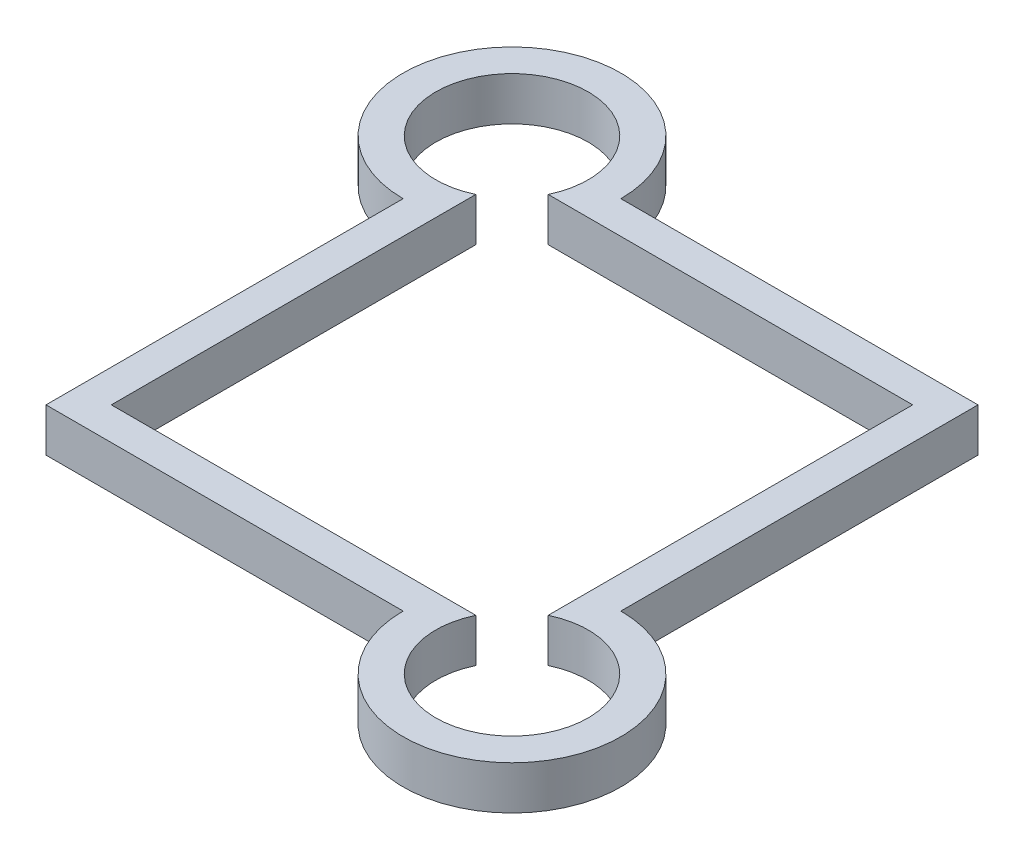
ISO-10303-21;
HEADER;
FILE_DESCRIPTION(('STEP AP214'),'2;1');
FILE_NAME('part.step','',(''),(''),'','','');
FILE_SCHEMA(('AUTOMOTIVE_DESIGN { 1 0 10303 214 1 1 1 1 }'));
ENDSEC;
DATA;
#1=APPLICATION_CONTEXT('core data for automotive mechanical design processes');
#2=APPLICATION_PROTOCOL_DEFINITION('international standard','automotive_design',2000,#1);
#3=PRODUCT_CONTEXT('',#1,'mechanical');
#4=PRODUCT('Part','Part','',(#3));
#5=PRODUCT_RELATED_PRODUCT_CATEGORY('part','',(#4));
#6=PRODUCT_DEFINITION_FORMATION('','',#4);
#7=PRODUCT_DEFINITION_CONTEXT('part definition',#1,'design');
#8=PRODUCT_DEFINITION('design','',#6,#7);
#9=PRODUCT_DEFINITION_SHAPE('','',#8);
#10=(LENGTH_UNIT() NAMED_UNIT(*) SI_UNIT(.MILLI.,.METRE.));
#11=(NAMED_UNIT(*) PLANE_ANGLE_UNIT() SI_UNIT($,.RADIAN.));
#12=(NAMED_UNIT(*) SI_UNIT($,.STERADIAN.) SOLID_ANGLE_UNIT());
#13=UNCERTAINTY_MEASURE_WITH_UNIT(LENGTH_MEASURE(1.E-05),#10,'distance_accuracy_value','');
#14=(GEOMETRIC_REPRESENTATION_CONTEXT(3) GLOBAL_UNCERTAINTY_ASSIGNED_CONTEXT((#13)) GLOBAL_UNIT_ASSIGNED_CONTEXT((#10,
#11,#12)) REPRESENTATION_CONTEXT('',''));
#15=CARTESIAN_POINT('',(0.,0.,0.));
#16=DIRECTION('',(0.,0.,1.));
#17=DIRECTION('',(1.,0.,0.));
#18=AXIS2_PLACEMENT_3D('',#15,#16,#17);
#19=CARTESIAN_POINT('',(116.153392330384,20.,131.619469026549));
#20=DIRECTION('',(0.,-1.,0.));
#21=DIRECTION('',(0.,0.,-1.));
#22=AXIS2_PLACEMENT_3D('',#19,#20,#21);
#23=PLANE('',#22);
#24=DIRECTION('',(1.,0.,0.));
#25=VECTOR('',#24,1.);
#26=CARTESIAN_POINT('',(-97.8466076696164,20.,131.619469026549));
#27=LINE('',#26,#25);
#28=CARTESIAN_POINT('',(-97.8466076696164,20.,131.619469026549));
#29=VERTEX_POINT('',#28);
#30=CARTESIAN_POINT('',(66.1533923303835,20.,131.619469026549));
#31=VERTEX_POINT('',#30);
#32=EDGE_CURVE('E173',#29,#31,#27,.T.);
#33=ORIENTED_EDGE('',*,*,#32,.T.);
#34=CARTESIAN_POINT('',(116.153392330384,20.,131.619469026549));
#35=DIRECTION('',(0.,1.,0.));
#36=DIRECTION('',(0.,0.,-1.));
#37=AXIS2_PLACEMENT_3D('',#34,#35,#36);
#38=CIRCLE('',#37,50.0000000000001);
#39=CARTESIAN_POINT('',(116.153392330384,20.,81.6194690265486));
#40=VERTEX_POINT('',#39);
#41=EDGE_CURVE('E176',#31,#40,#38,.T.);
#42=ORIENTED_EDGE('',*,*,#41,.T.);
#43=DIRECTION('',(0.,0.,-1.));
#44=VECTOR('',#43,1.);
#45=CARTESIAN_POINT('',(116.153392330384,20.,-82.3805309734513));
#46=LINE('',#45,#44);
#47=CARTESIAN_POINT('',(116.153392330384,20.,-82.3805309734513));
#48=VERTEX_POINT('',#47);
#49=EDGE_CURVE('E179',#40,#48,#46,.T.);
#50=ORIENTED_EDGE('',*,*,#49,.T.);
#51=DIRECTION('',(-1.,0.,0.));
#52=VECTOR('',#51,1.);
#53=CARTESIAN_POINT('',(-47.8466076696164,20.,-82.3805309734513));
#54=LINE('',#53,#52);
#55=CARTESIAN_POINT('',(-47.8466076696164,20.,-82.3805309734513));
#56=VERTEX_POINT('',#55);
#57=EDGE_CURVE('E181',#48,#56,#54,.T.);
#58=ORIENTED_EDGE('',*,*,#57,.T.);
#59=CARTESIAN_POINT('',(-97.8466076696164,20.,-82.3805309734513));
#60=DIRECTION('',(0.,1.,0.));
#61=DIRECTION('',(0.,0.,1.));
#62=AXIS2_PLACEMENT_3D('',#59,#60,#61);
#63=CIRCLE('',#62,50.);
#64=CARTESIAN_POINT('',(-97.8466076696164,20.,-32.3805309734513));
#65=VERTEX_POINT('',#64);
#66=EDGE_CURVE('E183',#56,#65,#63,.T.);
#67=ORIENTED_EDGE('',*,*,#66,.T.);
#68=DIRECTION('',(0.,0.,1.));
#69=VECTOR('',#68,1.);
#70=CARTESIAN_POINT('',(-97.8466076696164,20.,-32.3805309734513));
#71=LINE('',#70,#69);
#72=EDGE_CURVE('E185',#65,#29,#71,.T.);
#73=ORIENTED_EDGE('',*,*,#72,.T.);
#74=EDGE_LOOP('',(#33,#42,#50,#58,#67,#73));
#75=FACE_BOUND('',#74,.T.);
#76=DIRECTION('',(1.,0.,0.));
#77=VECTOR('',#76,1.);
#78=CARTESIAN_POINT('',(-82.8466076696164,20.,116.619469026549));
#79=LINE('',#78,#77);
#80=CARTESIAN_POINT('',(-82.8466076696164,20.,116.619469026549));
#81=VERTEX_POINT('',#80);
#82=CARTESIAN_POINT('',(84.5306157286997,20.,116.619469026549));
#83=VERTEX_POINT('',#82);
#84=EDGE_CURVE('E122',#81,#83,#79,.T.);
#85=ORIENTED_EDGE('',*,*,#84,.F.);
#86=DIRECTION('',(0.,0.,1.));
#87=VECTOR('',#86,1.);
#88=CARTESIAN_POINT('',(-82.8466076696164,20.,-50.7577543717675));
#89=LINE('',#88,#87);
#90=CARTESIAN_POINT('',(-82.8466076696164,20.,-50.7577543717675));
#91=VERTEX_POINT('',#90);
#92=EDGE_CURVE('E151',#91,#81,#89,.T.);
#93=ORIENTED_EDGE('',*,*,#92,.F.);
#94=CARTESIAN_POINT('',(-97.8466076696164,20.,-82.3805309734513));
#95=DIRECTION('',(0.,1.,0.));
#96=DIRECTION('',(0.,0.,1.));
#97=AXIS2_PLACEMENT_3D('',#94,#95,#96);
#98=CIRCLE('',#97,35.);
#99=CARTESIAN_POINT('',(-66.2238310679326,20.,-67.3805309734513));
#100=VERTEX_POINT('',#99);
#101=EDGE_CURVE('E149',#100,#91,#98,.T.);
#102=ORIENTED_EDGE('',*,*,#101,.F.);
#103=DIRECTION('',(-1.,0.,0.));
#104=VECTOR('',#103,1.);
#105=CARTESIAN_POINT('',(-66.2238310679326,20.,-67.3805309734513));
#106=LINE('',#105,#104);
#107=CARTESIAN_POINT('',(101.153392330384,20.,-67.3805309734513));
#108=VERTEX_POINT('',#107);
#109=EDGE_CURVE('E145',#108,#100,#106,.T.);
#110=ORIENTED_EDGE('',*,*,#109,.F.);
#111=DIRECTION('',(0.,0.,-1.));
#112=VECTOR('',#111,1.);
#113=CARTESIAN_POINT('',(101.153392330384,20.,-67.3805309734513));
#114=LINE('',#113,#112);
#115=CARTESIAN_POINT('',(101.153392330384,20.,99.9966924248648));
#116=VERTEX_POINT('',#115);
#117=EDGE_CURVE('E143',#116,#108,#114,.T.);
#118=ORIENTED_EDGE('',*,*,#117,.F.);
#119=CARTESIAN_POINT('',(116.153392330384,20.,131.619469026549));
#120=DIRECTION('',(0.,1.,0.));
#121=DIRECTION('',(0.,0.,-1.));
#122=AXIS2_PLACEMENT_3D('',#119,#120,#121);
#123=CIRCLE('',#122,35.0000000000001);
#124=EDGE_CURVE('E130',#83,#116,#123,.T.);
#125=ORIENTED_EDGE('',*,*,#124,.F.);
#126=EDGE_LOOP('',(#85,#93,#102,#110,#118,#125));
#127=FACE_BOUND('',#126,.T.);
#128=ADVANCED_FACE('F33',(#75,#127),#23,.F.);
#129=CARTESIAN_POINT('',(116.153392330384,0.,131.619469026549));
#130=DIRECTION('',(0.,-1.,0.));
#131=DIRECTION('',(0.,0.,-1.));
#132=AXIS2_PLACEMENT_3D('',#129,#130,#131);
#133=PLANE('',#132);
#134=DIRECTION('',(1.,0.,0.));
#135=VECTOR('',#134,1.);
#136=CARTESIAN_POINT('',(-97.8466076696164,0.,131.619469026549));
#137=LINE('',#136,#135);
#138=CARTESIAN_POINT('',(-97.8466076696164,0.,131.619469026549));
#139=VERTEX_POINT('',#138);
#140=CARTESIAN_POINT('',(66.1533923303835,0.,131.619469026549));
#141=VERTEX_POINT('',#140);
#142=EDGE_CURVE('E138',#139,#141,#137,.T.);
#143=ORIENTED_EDGE('',*,*,#142,.F.);
#144=DIRECTION('',(0.,0.,1.));
#145=VECTOR('',#144,1.);
#146=CARTESIAN_POINT('',(-97.8466076696164,0.,-32.3805309734513));
#147=LINE('',#146,#145);
#148=CARTESIAN_POINT('',(-97.8466076696164,0.,-32.3805309734513));
#149=VERTEX_POINT('',#148);
#150=EDGE_CURVE('E177',#149,#139,#147,.T.);
#151=ORIENTED_EDGE('',*,*,#150,.F.);
#152=CARTESIAN_POINT('',(-97.8466076696164,0.,-82.3805309734513));
#153=DIRECTION('',(0.,1.,0.));
#154=DIRECTION('',(0.,0.,1.));
#155=AXIS2_PLACEMENT_3D('',#152,#153,#154);
#156=CIRCLE('',#155,50.);
#157=CARTESIAN_POINT('',(-47.8466076696164,0.,-82.3805309734513));
#158=VERTEX_POINT('',#157);
#159=EDGE_CURVE('E196',#158,#149,#156,.T.);
#160=ORIENTED_EDGE('',*,*,#159,.F.);
#161=DIRECTION('',(-1.,0.,0.));
#162=VECTOR('',#161,1.);
#163=CARTESIAN_POINT('',(-47.8466076696164,0.,-82.3805309734513));
#164=LINE('',#163,#162);
#165=CARTESIAN_POINT('',(116.153392330384,0.,-82.3805309734513));
#166=VERTEX_POINT('',#165);
#167=EDGE_CURVE('E194',#166,#158,#164,.T.);
#168=ORIENTED_EDGE('',*,*,#167,.F.);
#169=DIRECTION('',(0.,0.,-1.));
#170=VECTOR('',#169,1.);
#171=CARTESIAN_POINT('',(116.153392330384,0.,-82.3805309734513));
#172=LINE('',#171,#170);
#173=CARTESIAN_POINT('',(116.153392330384,0.,81.6194690265486));
#174=VERTEX_POINT('',#173);
#175=EDGE_CURVE('E192',#174,#166,#172,.T.);
#176=ORIENTED_EDGE('',*,*,#175,.F.);
#177=CARTESIAN_POINT('',(116.153392330384,0.,131.619469026549));
#178=DIRECTION('',(0.,1.,0.));
#179=DIRECTION('',(0.,0.,-1.));
#180=AXIS2_PLACEMENT_3D('',#177,#178,#179);
#181=CIRCLE('',#180,50.0000000000001);
#182=EDGE_CURVE('E190',#141,#174,#181,.T.);
#183=ORIENTED_EDGE('',*,*,#182,.F.);
#184=EDGE_LOOP('',(#143,#151,#160,#168,#176,#183));
#185=FACE_BOUND('',#184,.T.);
#186=DIRECTION('',(0.,0.,1.));
#187=VECTOR('',#186,1.);
#188=CARTESIAN_POINT('',(-82.8466076696164,0.,-50.7577543717675));
#189=LINE('',#188,#187);
#190=CARTESIAN_POINT('',(-82.8466076696164,0.,-50.7577543717675));
#191=VERTEX_POINT('',#190);
#192=CARTESIAN_POINT('',(-82.8466076696164,0.,116.619469026549));
#193=VERTEX_POINT('',#192);
#194=EDGE_CURVE('E131',#191,#193,#189,.T.);
#195=ORIENTED_EDGE('',*,*,#194,.T.);
#196=DIRECTION('',(1.,0.,0.));
#197=VECTOR('',#196,1.);
#198=CARTESIAN_POINT('',(-82.8466076696164,0.,116.619469026549));
#199=LINE('',#198,#197);
#200=CARTESIAN_POINT('',(84.5306157286997,0.,116.619469026549));
#201=VERTEX_POINT('',#200);
#202=EDGE_CURVE('E56',#193,#201,#199,.T.);
#203=ORIENTED_EDGE('',*,*,#202,.T.);
#204=CARTESIAN_POINT('',(116.153392330384,0.,131.619469026549));
#205=DIRECTION('',(0.,1.,0.));
#206=DIRECTION('',(0.,0.,-1.));
#207=AXIS2_PLACEMENT_3D('',#204,#205,#206);
#208=CIRCLE('',#207,35.0000000000001);
#209=CARTESIAN_POINT('',(101.153392330384,0.,99.9966924248648));
#210=VERTEX_POINT('',#209);
#211=EDGE_CURVE('E137',#201,#210,#208,.T.);
#212=ORIENTED_EDGE('',*,*,#211,.T.);
#213=DIRECTION('',(0.,0.,-1.));
#214=VECTOR('',#213,1.);
#215=CARTESIAN_POINT('',(101.153392330384,0.,-67.3805309734513));
#216=LINE('',#215,#214);
#217=CARTESIAN_POINT('',(101.153392330384,0.,-67.3805309734513));
#218=VERTEX_POINT('',#217);
#219=EDGE_CURVE('E155',#210,#218,#216,.T.);
#220=ORIENTED_EDGE('',*,*,#219,.T.);
#221=DIRECTION('',(-1.,0.,0.));
#222=VECTOR('',#221,1.);
#223=CARTESIAN_POINT('',(-66.2238310679326,0.,-67.3805309734513));
#224=LINE('',#223,#222);
#225=CARTESIAN_POINT('',(-66.2238310679326,0.,-67.3805309734513));
#226=VERTEX_POINT('',#225);
#227=EDGE_CURVE('E158',#218,#226,#224,.T.);
#228=ORIENTED_EDGE('',*,*,#227,.T.);
#229=CARTESIAN_POINT('',(-97.8466076696164,0.,-82.3805309734513));
#230=DIRECTION('',(0.,1.,0.));
#231=DIRECTION('',(0.,0.,1.));
#232=AXIS2_PLACEMENT_3D('',#229,#230,#231);
#233=CIRCLE('',#232,35.);
#234=EDGE_CURVE('E161',#226,#191,#233,.T.);
#235=ORIENTED_EDGE('',*,*,#234,.T.);
#236=EDGE_LOOP('',(#195,#203,#212,#220,#228,#235));
#237=FACE_BOUND('',#236,.T.);
#238=ADVANCED_FACE('F220',(#185,#237),#133,.T.);
#239=CARTESIAN_POINT('',(-97.8466076696164,20.,131.619469026549));
#240=DIRECTION('',(0.,0.,-1.));
#241=DIRECTION('',(-1.,0.,0.));
#242=AXIS2_PLACEMENT_3D('',#239,#240,#241);
#243=PLANE('',#242);
#244=ORIENTED_EDGE('',*,*,#142,.T.);
#245=DIRECTION('',(0.,-1.,0.));
#246=VECTOR('',#245,1.);
#247=CARTESIAN_POINT('',(66.1533923303835,20.,131.619469026549));
#248=LINE('',#247,#246);
#249=EDGE_CURVE('E11',#31,#141,#248,.T.);
#250=ORIENTED_EDGE('',*,*,#249,.F.);
#251=ORIENTED_EDGE('',*,*,#32,.F.);
#252=DIRECTION('',(0.,-1.,0.));
#253=VECTOR('',#252,1.);
#254=CARTESIAN_POINT('',(-97.8466076696164,20.,131.619469026549));
#255=LINE('',#254,#253);
#256=EDGE_CURVE('E187',#29,#139,#255,.T.);
#257=ORIENTED_EDGE('',*,*,#256,.T.);
#258=EDGE_LOOP('',(#244,#250,#251,#257));
#259=FACE_BOUND('',#258,.T.);
#260=ADVANCED_FACE('F35',(#259),#243,.F.);
#261=CARTESIAN_POINT('',(116.153392330384,20.,131.619469026549));
#262=DIRECTION('',(0.,-1.,0.));
#263=DIRECTION('',(0.,0.,-1.));
#264=AXIS2_PLACEMENT_3D('',#261,#262,#263);
#265=CYLINDRICAL_SURFACE('',#264,50.0000000000001);
#266=ORIENTED_EDGE('',*,*,#182,.T.);
#267=DIRECTION('',(0.,-1.,0.));
#268=VECTOR('',#267,1.);
#269=CARTESIAN_POINT('',(116.153392330384,20.,81.6194690265486));
#270=LINE('',#269,#268);
#271=EDGE_CURVE('E41',#40,#174,#270,.T.);
#272=ORIENTED_EDGE('',*,*,#271,.F.);
#273=ORIENTED_EDGE('',*,*,#41,.F.);
#274=ORIENTED_EDGE('',*,*,#249,.T.);
#275=EDGE_LOOP('',(#266,#272,#273,#274));
#276=FACE_BOUND('',#275,.T.);
#277=ADVANCED_FACE('F237',(#276),#265,.T.);
#278=CARTESIAN_POINT('',(116.153392330384,20.,-82.3805309734513));
#279=DIRECTION('',(-1.,0.,0.));
#280=DIRECTION('',(0.,0.,1.));
#281=AXIS2_PLACEMENT_3D('',#278,#279,#280);
#282=PLANE('',#281);
#283=ORIENTED_EDGE('',*,*,#175,.T.);
#284=DIRECTION('',(0.,-1.,0.));
#285=VECTOR('',#284,1.);
#286=CARTESIAN_POINT('',(116.153392330384,20.,-82.3805309734513));
#287=LINE('',#286,#285);
#288=EDGE_CURVE('E207',#48,#166,#287,.T.);
#289=ORIENTED_EDGE('',*,*,#288,.F.);
#290=ORIENTED_EDGE('',*,*,#49,.F.);
#291=ORIENTED_EDGE('',*,*,#271,.T.);
#292=EDGE_LOOP('',(#283,#289,#290,#291));
#293=FACE_BOUND('',#292,.T.);
#294=ADVANCED_FACE('F214',(#293),#282,.F.);
#295=CARTESIAN_POINT('',(-47.8466076696164,20.,-82.3805309734513));
#296=DIRECTION('',(0.,0.,1.));
#297=DIRECTION('',(1.,0.,0.));
#298=AXIS2_PLACEMENT_3D('',#295,#296,#297);
#299=PLANE('',#298);
#300=ORIENTED_EDGE('',*,*,#167,.T.);
#301=DIRECTION('',(0.,-1.,0.));
#302=VECTOR('',#301,1.);
#303=CARTESIAN_POINT('',(-47.8466076696164,20.,-82.3805309734513));
#304=LINE('',#303,#302);
#305=EDGE_CURVE('E204',#56,#158,#304,.T.);
#306=ORIENTED_EDGE('',*,*,#305,.F.);
#307=ORIENTED_EDGE('',*,*,#57,.F.);
#308=ORIENTED_EDGE('',*,*,#288,.T.);
#309=EDGE_LOOP('',(#300,#306,#307,#308));
#310=FACE_BOUND('',#309,.T.);
#311=ADVANCED_FACE('F226',(#310),#299,.F.);
#312=CARTESIAN_POINT('',(-97.8466076696164,20.,-82.3805309734513));
#313=DIRECTION('',(0.,-1.,0.));
#314=DIRECTION('',(0.,0.,-1.));
#315=AXIS2_PLACEMENT_3D('',#312,#313,#314);
#316=CYLINDRICAL_SURFACE('',#315,50.);
#317=ORIENTED_EDGE('',*,*,#159,.T.);
#318=DIRECTION('',(0.,-1.,0.));
#319=VECTOR('',#318,1.);
#320=CARTESIAN_POINT('',(-97.8466076696164,20.,-32.3805309734513));
#321=LINE('',#320,#319);
#322=EDGE_CURVE('E201',#65,#149,#321,.T.);
#323=ORIENTED_EDGE('',*,*,#322,.F.);
#324=ORIENTED_EDGE('',*,*,#66,.F.);
#325=ORIENTED_EDGE('',*,*,#305,.T.);
#326=EDGE_LOOP('',(#317,#323,#324,#325));
#327=FACE_BOUND('',#326,.T.);
#328=ADVANCED_FACE('F230',(#327),#316,.T.);
#329=CARTESIAN_POINT('',(-97.8466076696164,20.,-32.3805309734513));
#330=DIRECTION('',(1.,0.,0.));
#331=DIRECTION('',(0.,0.,-1.));
#332=AXIS2_PLACEMENT_3D('',#329,#330,#331);
#333=PLANE('',#332);
#334=ORIENTED_EDGE('',*,*,#150,.T.);
#335=ORIENTED_EDGE('',*,*,#256,.F.);
#336=ORIENTED_EDGE('',*,*,#72,.F.);
#337=ORIENTED_EDGE('',*,*,#322,.T.);
#338=EDGE_LOOP('',(#334,#335,#336,#337));
#339=FACE_BOUND('',#338,.T.);
#340=ADVANCED_FACE('F240',(#339),#333,.F.);
#341=CARTESIAN_POINT('',(-82.8466076696164,20.,116.619469026549));
#342=DIRECTION('',(0.,0.,-1.));
#343=DIRECTION('',(-1.,0.,0.));
#344=AXIS2_PLACEMENT_3D('',#341,#342,#343);
#345=PLANE('',#344);
#346=ORIENTED_EDGE('',*,*,#202,.F.);
#347=DIRECTION('',(0.,-1.,0.));
#348=VECTOR('',#347,1.);
#349=CARTESIAN_POINT('',(-82.8466076696164,20.,116.619469026549));
#350=LINE('',#349,#348);
#351=EDGE_CURVE('E126',#81,#193,#350,.T.);
#352=ORIENTED_EDGE('',*,*,#351,.F.);
#353=ORIENTED_EDGE('',*,*,#84,.T.);
#354=DIRECTION('',(0.,-1.,0.));
#355=VECTOR('',#354,1.);
#356=CARTESIAN_POINT('',(84.5306157286997,20.,116.619469026549));
#357=LINE('',#356,#355);
#358=EDGE_CURVE('E125',#83,#201,#357,.T.);
#359=ORIENTED_EDGE('',*,*,#358,.T.);
#360=EDGE_LOOP('',(#346,#352,#353,#359));
#361=FACE_BOUND('',#360,.T.);
#362=ADVANCED_FACE('F124',(#361),#345,.T.);
#363=CARTESIAN_POINT('',(116.153392330384,20.,131.619469026549));
#364=DIRECTION('',(0.,-1.,0.));
#365=DIRECTION('',(0.,0.,-1.));
#366=AXIS2_PLACEMENT_3D('',#363,#364,#365);
#367=CYLINDRICAL_SURFACE('',#366,35.0000000000001);
#368=ORIENTED_EDGE('',*,*,#211,.F.);
#369=ORIENTED_EDGE('',*,*,#358,.F.);
#370=ORIENTED_EDGE('',*,*,#124,.T.);
#371=DIRECTION('',(0.,-1.,0.));
#372=VECTOR('',#371,1.);
#373=CARTESIAN_POINT('',(101.153392330384,20.,99.9966924248648));
#374=LINE('',#373,#372);
#375=EDGE_CURVE('E139',#116,#210,#374,.T.);
#376=ORIENTED_EDGE('',*,*,#375,.T.);
#377=EDGE_LOOP('',(#368,#369,#370,#376));
#378=FACE_BOUND('',#377,.T.);
#379=ADVANCED_FACE('F134',(#378),#367,.F.);
#380=CARTESIAN_POINT('',(101.153392330384,20.,-67.3805309734513));
#381=DIRECTION('',(-1.,0.,0.));
#382=DIRECTION('',(0.,0.,1.));
#383=AXIS2_PLACEMENT_3D('',#380,#381,#382);
#384=PLANE('',#383);
#385=ORIENTED_EDGE('',*,*,#219,.F.);
#386=ORIENTED_EDGE('',*,*,#375,.F.);
#387=ORIENTED_EDGE('',*,*,#117,.T.);
#388=DIRECTION('',(0.,-1.,0.));
#389=VECTOR('',#388,1.);
#390=CARTESIAN_POINT('',(101.153392330384,20.,-67.3805309734513));
#391=LINE('',#390,#389);
#392=EDGE_CURVE('E170',#108,#218,#391,.T.);
#393=ORIENTED_EDGE('',*,*,#392,.T.);
#394=EDGE_LOOP('',(#385,#386,#387,#393));
#395=FACE_BOUND('',#394,.T.);
#396=ADVANCED_FACE('F258',(#395),#384,.T.);
#397=CARTESIAN_POINT('',(-66.2238310679326,20.,-67.3805309734513));
#398=DIRECTION('',(0.,0.,1.));
#399=DIRECTION('',(1.,0.,0.));
#400=AXIS2_PLACEMENT_3D('',#397,#398,#399);
#401=PLANE('',#400);
#402=ORIENTED_EDGE('',*,*,#227,.F.);
#403=ORIENTED_EDGE('',*,*,#392,.F.);
#404=ORIENTED_EDGE('',*,*,#109,.T.);
#405=DIRECTION('',(0.,-1.,0.));
#406=VECTOR('',#405,1.);
#407=CARTESIAN_POINT('',(-66.2238310679326,20.,-67.3805309734513));
#408=LINE('',#407,#406);
#409=EDGE_CURVE('E168',#100,#226,#408,.T.);
#410=ORIENTED_EDGE('',*,*,#409,.T.);
#411=EDGE_LOOP('',(#402,#403,#404,#410));
#412=FACE_BOUND('',#411,.T.);
#413=ADVANCED_FACE('F261',(#412),#401,.T.);
#414=CARTESIAN_POINT('',(-97.8466076696164,20.,-82.3805309734513));
#415=DIRECTION('',(0.,-1.,0.));
#416=DIRECTION('',(0.,0.,-1.));
#417=AXIS2_PLACEMENT_3D('',#414,#415,#416);
#418=CYLINDRICAL_SURFACE('',#417,35.);
#419=ORIENTED_EDGE('',*,*,#234,.F.);
#420=ORIENTED_EDGE('',*,*,#409,.F.);
#421=ORIENTED_EDGE('',*,*,#101,.T.);
#422=DIRECTION('',(0.,-1.,0.));
#423=VECTOR('',#422,1.);
#424=CARTESIAN_POINT('',(-82.8466076696164,20.,-50.7577543717675));
#425=LINE('',#424,#423);
#426=EDGE_CURVE('E48',#91,#191,#425,.T.);
#427=ORIENTED_EDGE('',*,*,#426,.T.);
#428=EDGE_LOOP('',(#419,#420,#421,#427));
#429=FACE_BOUND('',#428,.T.);
#430=ADVANCED_FACE('F265',(#429),#418,.F.);
#431=CARTESIAN_POINT('',(-82.8466076696164,20.,-50.7577543717675));
#432=DIRECTION('',(1.,0.,0.));
#433=DIRECTION('',(0.,0.,-1.));
#434=AXIS2_PLACEMENT_3D('',#431,#432,#433);
#435=PLANE('',#434);
#436=ORIENTED_EDGE('',*,*,#194,.F.);
#437=ORIENTED_EDGE('',*,*,#426,.F.);
#438=ORIENTED_EDGE('',*,*,#92,.T.);
#439=ORIENTED_EDGE('',*,*,#351,.T.);
#440=EDGE_LOOP('',(#436,#437,#438,#439));
#441=FACE_BOUND('',#440,.T.);
#442=ADVANCED_FACE('F269',(#441),#435,.T.);
#443=CLOSED_SHELL('',(#128,#238,#260,#277,#294,#311,#328,#340,#362,#379,#396,#413,#430,#442));
#444=MANIFOLD_SOLID_BREP('B2',#443);
#445=ADVANCED_BREP_SHAPE_REPRESENTATION('',(#18,#444),#14);
#446=SHAPE_DEFINITION_REPRESENTATION(#9,#445);
ENDSEC;
END-ISO-10303-21;
